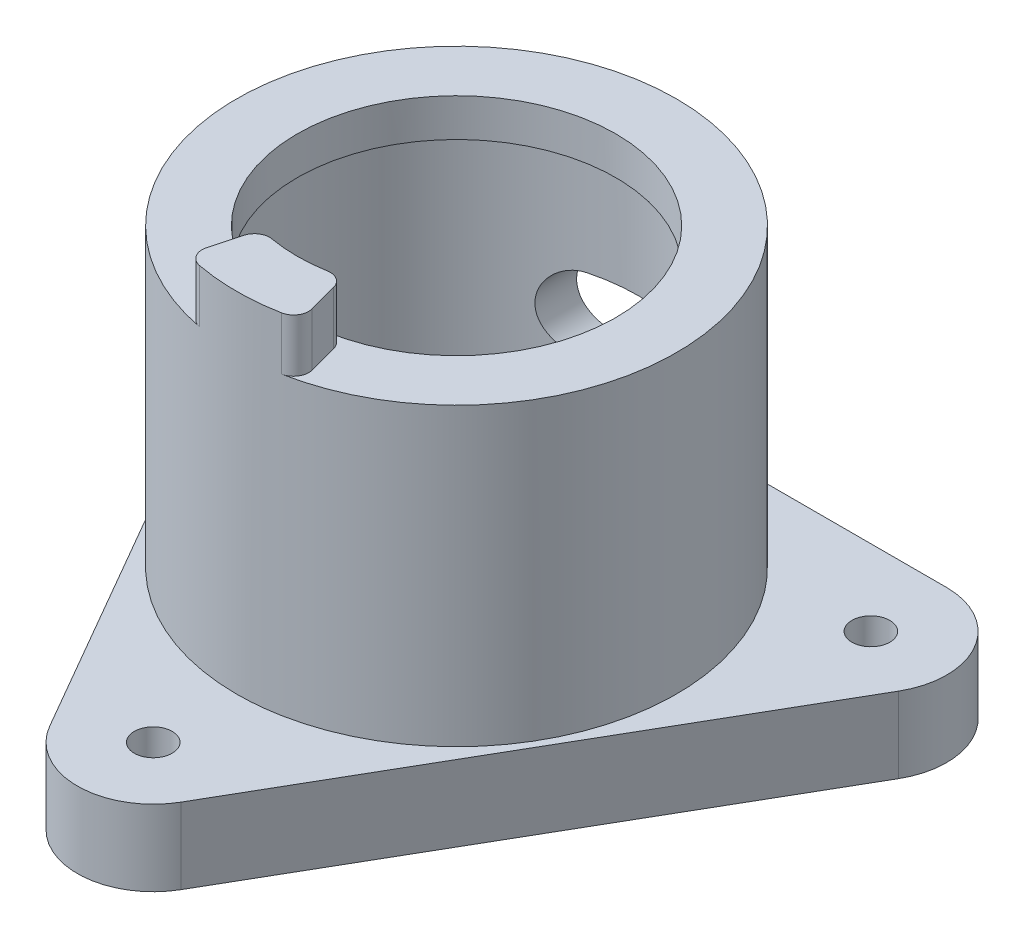
ISO-10303-21;
HEADER;
FILE_DESCRIPTION(('STEP AP214'),'2;1');
FILE_NAME('part.step','',(''),(''),'','','');
FILE_SCHEMA(('AUTOMOTIVE_DESIGN { 1 0 10303 214 1 1 1 1 }'));
ENDSEC;
DATA;
#1=APPLICATION_CONTEXT('core data for automotive mechanical design processes');
#2=APPLICATION_PROTOCOL_DEFINITION('international standard','automotive_design',2000,#1);
#3=PRODUCT_CONTEXT('',#1,'mechanical');
#4=PRODUCT('Part','Part','',(#3));
#5=PRODUCT_RELATED_PRODUCT_CATEGORY('part','',(#4));
#6=PRODUCT_DEFINITION_FORMATION('','',#4);
#7=PRODUCT_DEFINITION_CONTEXT('part definition',#1,'design');
#8=PRODUCT_DEFINITION('design','',#6,#7);
#9=PRODUCT_DEFINITION_SHAPE('','',#8);
#10=(LENGTH_UNIT() NAMED_UNIT(*) SI_UNIT(.MILLI.,.METRE.));
#11=(NAMED_UNIT(*) PLANE_ANGLE_UNIT() SI_UNIT($,.RADIAN.));
#12=(NAMED_UNIT(*) SI_UNIT($,.STERADIAN.) SOLID_ANGLE_UNIT());
#13=UNCERTAINTY_MEASURE_WITH_UNIT(LENGTH_MEASURE(1.E-05),#10,'distance_accuracy_value','');
#14=(GEOMETRIC_REPRESENTATION_CONTEXT(3) GLOBAL_UNCERTAINTY_ASSIGNED_CONTEXT((#13)) GLOBAL_UNIT_ASSIGNED_CONTEXT((#10,
#11,#12)) REPRESENTATION_CONTEXT('',''));
#15=CARTESIAN_POINT('',(0.,0.,0.));
#16=DIRECTION('',(0.,0.,1.));
#17=DIRECTION('',(1.,0.,0.));
#18=AXIS2_PLACEMENT_3D('',#15,#16,#17);
#19=CARTESIAN_POINT('',(17.3205080756888,5.,-9.99999999999998));
#20=DIRECTION('',(0.,1.,0.));
#21=DIRECTION('',(0.,0.,1.));
#22=AXIS2_PLACEMENT_3D('',#19,#20,#21);
#23=PLANE('',#22);
#24=CARTESIAN_POINT('',(17.3205080756888,5.,-9.99999999999998));
#25=DIRECTION('',(0.,1.,0.));
#26=DIRECTION('',(0.,0.,1.));
#27=AXIS2_PLACEMENT_3D('',#24,#25,#26);
#28=CIRCLE('',#27,5.);
#29=CARTESIAN_POINT('',(21.6506350946111,5.,-7.49999999999974));
#30=VERTEX_POINT('',#29);
#31=CARTESIAN_POINT('',(17.3205080756889,5.,-14.9999999999998));
#32=VERTEX_POINT('',#31);
#33=EDGE_CURVE('E289',#30,#32,#28,.T.);
#34=ORIENTED_EDGE('',*,*,#33,.T.);
#35=DIRECTION('',(-1.,0.,0.));
#36=VECTOR('',#35,1.);
#37=CARTESIAN_POINT('',(17.3205080756889,5.,-14.9999999999998));
#38=LINE('',#37,#36);
#39=CARTESIAN_POINT('',(-17.3205080756886,5.,-15.));
#40=VERTEX_POINT('',#39);
#41=EDGE_CURVE('E330',#32,#40,#38,.T.);
#42=ORIENTED_EDGE('',*,*,#41,.T.);
#43=CARTESIAN_POINT('',(-17.3205080756886,5.,-9.99999999999996));
#44=DIRECTION('',(0.,1.,0.));
#45=DIRECTION('',(0.,0.,1.));
#46=AXIS2_PLACEMENT_3D('',#43,#44,#45);
#47=CIRCLE('',#46,5.00000000000007);
#48=CARTESIAN_POINT('',(-21.6506350946109,5.,-7.50000000000001));
#49=VERTEX_POINT('',#48);
#50=EDGE_CURVE('E333',#40,#49,#47,.T.);
#51=ORIENTED_EDGE('',*,*,#50,.T.);
#52=DIRECTION('',(0.499999999999998,0.,0.86602540378444));
#53=VECTOR('',#52,1.);
#54=CARTESIAN_POINT('',(-21.6506350946109,5.,-7.50000000000001));
#55=LINE('',#54,#53);
#56=CARTESIAN_POINT('',(-4.33012701892213,5.,22.4999999999999));
#57=VERTEX_POINT('',#56);
#58=EDGE_CURVE('E335',#49,#57,#55,.T.);
#59=ORIENTED_EDGE('',*,*,#58,.T.);
#60=CARTESIAN_POINT('',(1.28191059012694E-13,5.,19.9999999999999));
#61=DIRECTION('',(0.,1.,0.));
#62=DIRECTION('',(0.,0.,1.));
#63=AXIS2_PLACEMENT_3D('',#60,#61,#62);
#64=CIRCLE('',#63,5.00000000000007);
#65=CARTESIAN_POINT('',(4.33012701892225,5.,22.5));
#66=VERTEX_POINT('',#65);
#67=EDGE_CURVE('E337',#57,#66,#64,.T.);
#68=ORIENTED_EDGE('',*,*,#67,.T.);
#69=DIRECTION('',(0.500000000000004,0.,-0.866025403784436));
#70=VECTOR('',#69,1.);
#71=CARTESIAN_POINT('',(21.6506350946111,5.,-7.49999999999974));
#72=LINE('',#71,#70);
#73=EDGE_CURVE('E339',#66,#30,#72,.T.);
#74=ORIENTED_EDGE('',*,*,#73,.T.);
#75=EDGE_LOOP('',(#34,#42,#51,#59,#68,#74));
#76=FACE_BOUND('',#75,.T.);
#77=CARTESIAN_POINT('',(0.,5.,20.));
#78=DIRECTION('',(0.,1.,0.));
#79=DIRECTION('',(0.,0.,1.));
#80=AXIS2_PLACEMENT_3D('',#77,#78,#79);
#81=CIRCLE('',#80,1.25);
#82=CARTESIAN_POINT('',(0.,5.,21.25));
#83=VERTEX_POINT('',#82);
#84=EDGE_CURVE('E294',#83,#83,#81,.T.);
#85=ORIENTED_EDGE('',*,*,#84,.F.);
#86=EDGE_LOOP('',(#85));
#87=FACE_BOUND('',#86,.T.);
#88=CARTESIAN_POINT('',(-17.3205080756888,5.,-9.99999999999999));
#89=DIRECTION('',(0.,1.,0.));
#90=DIRECTION('',(0.,0.,1.));
#91=AXIS2_PLACEMENT_3D('',#88,#89,#90);
#92=CIRCLE('',#91,1.25);
#93=CARTESIAN_POINT('',(-17.3205080756888,5.,-8.75));
#94=VERTEX_POINT('',#93);
#95=EDGE_CURVE('E298',#94,#94,#92,.T.);
#96=ORIENTED_EDGE('',*,*,#95,.F.);
#97=EDGE_LOOP('',(#96));
#98=FACE_BOUND('',#97,.T.);
#99=CARTESIAN_POINT('',(17.3205080756888,5.,-10.));
#100=DIRECTION('',(0.,1.,0.));
#101=DIRECTION('',(0.,0.,1.));
#102=AXIS2_PLACEMENT_3D('',#99,#100,#101);
#103=CIRCLE('',#102,1.25);
#104=CARTESIAN_POINT('',(17.3205080756888,5.,-8.75000000000001));
#105=VERTEX_POINT('',#104);
#106=EDGE_CURVE('E302',#105,#105,#103,.T.);
#107=ORIENTED_EDGE('',*,*,#106,.F.);
#108=EDGE_LOOP('',(#107));
#109=FACE_BOUND('',#108,.T.);
#110=CARTESIAN_POINT('',(0.,5.,0.));
#111=DIRECTION('',(0.,1.,0.));
#112=DIRECTION('',(0.,0.,1.));
#113=AXIS2_PLACEMENT_3D('',#110,#111,#112);
#114=CIRCLE('',#113,14.5);
#115=CARTESIAN_POINT('',(0.,5.,14.5));
#116=VERTEX_POINT('',#115);
#117=EDGE_CURVE('E305',#116,#116,#114,.T.);
#118=ORIENTED_EDGE('',*,*,#117,.F.);
#119=EDGE_LOOP('',(#118));
#120=FACE_BOUND('',#119,.T.);
#121=ADVANCED_FACE('F39',(#76,#87,#98,#109,#120),#23,.T.);
#122=CARTESIAN_POINT('',(17.3205080756888,0.,-9.99999999999998));
#123=DIRECTION('',(0.,1.,0.));
#124=DIRECTION('',(0.,0.,1.));
#125=AXIS2_PLACEMENT_3D('',#122,#123,#124);
#126=PLANE('',#125);
#127=CARTESIAN_POINT('',(17.3205080756888,0.,-10.));
#128=DIRECTION('',(0.,1.,0.));
#129=DIRECTION('',(0.,0.,1.));
#130=AXIS2_PLACEMENT_3D('',#127,#128,#129);
#131=CIRCLE('',#130,1.25);
#132=CARTESIAN_POINT('',(17.3205080756888,0.,-8.75000000000001));
#133=VERTEX_POINT('',#132);
#134=EDGE_CURVE('E308',#133,#133,#131,.T.);
#135=ORIENTED_EDGE('',*,*,#134,.T.);
#136=EDGE_LOOP('',(#135));
#137=FACE_BOUND('',#136,.T.);
#138=CARTESIAN_POINT('',(-17.3205080756888,0.,-9.99999999999999));
#139=DIRECTION('',(0.,1.,0.));
#140=DIRECTION('',(0.,0.,1.));
#141=AXIS2_PLACEMENT_3D('',#138,#139,#140);
#142=CIRCLE('',#141,1.25);
#143=CARTESIAN_POINT('',(-17.3205080756888,0.,-8.75));
#144=VERTEX_POINT('',#143);
#145=EDGE_CURVE('E317',#144,#144,#142,.T.);
#146=ORIENTED_EDGE('',*,*,#145,.T.);
#147=EDGE_LOOP('',(#146));
#148=FACE_BOUND('',#147,.T.);
#149=CARTESIAN_POINT('',(0.,0.,20.));
#150=DIRECTION('',(0.,1.,0.));
#151=DIRECTION('',(0.,0.,1.));
#152=AXIS2_PLACEMENT_3D('',#149,#150,#151);
#153=CIRCLE('',#152,1.25);
#154=CARTESIAN_POINT('',(0.,0.,21.25));
#155=VERTEX_POINT('',#154);
#156=EDGE_CURVE('E321',#155,#155,#153,.T.);
#157=ORIENTED_EDGE('',*,*,#156,.T.);
#158=EDGE_LOOP('',(#157));
#159=FACE_BOUND('',#158,.T.);
#160=CARTESIAN_POINT('',(17.3205080756888,0.,-9.99999999999998));
#161=DIRECTION('',(0.,1.,0.));
#162=DIRECTION('',(0.,0.,1.));
#163=AXIS2_PLACEMENT_3D('',#160,#161,#162);
#164=CIRCLE('',#163,5.);
#165=CARTESIAN_POINT('',(21.6506350946111,0.,-7.49999999999974));
#166=VERTEX_POINT('',#165);
#167=CARTESIAN_POINT('',(17.3205080756889,0.,-14.9999999999998));
#168=VERTEX_POINT('',#167);
#169=EDGE_CURVE('E328',#166,#168,#164,.T.);
#170=ORIENTED_EDGE('',*,*,#169,.F.);
#171=DIRECTION('',(0.500000000000004,0.,-0.866025403784436));
#172=VECTOR('',#171,1.);
#173=CARTESIAN_POINT('',(21.6506350946111,0.,-7.49999999999974));
#174=LINE('',#173,#172);
#175=CARTESIAN_POINT('',(4.33012701892225,0.,22.5));
#176=VERTEX_POINT('',#175);
#177=EDGE_CURVE('E331',#176,#166,#174,.T.);
#178=ORIENTED_EDGE('',*,*,#177,.F.);
#179=CARTESIAN_POINT('',(1.28191059012694E-13,0.,19.9999999999999));
#180=DIRECTION('',(0.,1.,0.));
#181=DIRECTION('',(0.,0.,1.));
#182=AXIS2_PLACEMENT_3D('',#179,#180,#181);
#183=CIRCLE('',#182,5.00000000000007);
#184=CARTESIAN_POINT('',(-4.33012701892213,0.,22.4999999999999));
#185=VERTEX_POINT('',#184);
#186=EDGE_CURVE('E350',#185,#176,#183,.T.);
#187=ORIENTED_EDGE('',*,*,#186,.F.);
#188=DIRECTION('',(0.499999999999998,0.,0.86602540378444));
#189=VECTOR('',#188,1.);
#190=CARTESIAN_POINT('',(-21.6506350946109,0.,-7.50000000000001));
#191=LINE('',#190,#189);
#192=CARTESIAN_POINT('',(-21.6506350946109,0.,-7.50000000000001));
#193=VERTEX_POINT('',#192);
#194=EDGE_CURVE('E348',#193,#185,#191,.T.);
#195=ORIENTED_EDGE('',*,*,#194,.F.);
#196=CARTESIAN_POINT('',(-17.3205080756886,0.,-9.99999999999996));
#197=DIRECTION('',(0.,1.,0.));
#198=DIRECTION('',(0.,0.,1.));
#199=AXIS2_PLACEMENT_3D('',#196,#197,#198);
#200=CIRCLE('',#199,5.00000000000007);
#201=CARTESIAN_POINT('',(-17.3205080756886,0.,-15.));
#202=VERTEX_POINT('',#201);
#203=EDGE_CURVE('E346',#202,#193,#200,.T.);
#204=ORIENTED_EDGE('',*,*,#203,.F.);
#205=DIRECTION('',(-1.,0.,0.));
#206=VECTOR('',#205,1.);
#207=CARTESIAN_POINT('',(17.3205080756889,0.,-14.9999999999998));
#208=LINE('',#207,#206);
#209=EDGE_CURVE('E344',#168,#202,#208,.T.);
#210=ORIENTED_EDGE('',*,*,#209,.F.);
#211=EDGE_LOOP('',(#170,#178,#187,#195,#204,#210));
#212=FACE_BOUND('',#211,.T.);
#213=CARTESIAN_POINT('',(0.,0.,0.));
#214=DIRECTION('',(0.,1.,0.));
#215=DIRECTION('',(0.,0.,1.));
#216=AXIS2_PLACEMENT_3D('',#213,#214,#215);
#217=CIRCLE('',#216,12.);
#218=CARTESIAN_POINT('',(0.,0.,12.));
#219=VERTEX_POINT('',#218);
#220=EDGE_CURVE('E324',#219,#219,#217,.T.);
#221=ORIENTED_EDGE('',*,*,#220,.T.);
#222=EDGE_LOOP('',(#221));
#223=FACE_BOUND('',#222,.T.);
#224=ADVANCED_FACE('F280',(#137,#148,#159,#212,#223),#126,.F.);
#225=CARTESIAN_POINT('',(17.3205080756888,5.,-9.99999999999998));
#226=DIRECTION('',(0.,-1.,0.));
#227=DIRECTION('',(0.,0.,-1.));
#228=AXIS2_PLACEMENT_3D('',#225,#226,#227);
#229=CYLINDRICAL_SURFACE('',#228,5.);
#230=ORIENTED_EDGE('',*,*,#169,.T.);
#231=DIRECTION('',(0.,-1.,0.));
#232=VECTOR('',#231,1.);
#233=CARTESIAN_POINT('',(17.3205080756889,5.,-14.9999999999998));
#234=LINE('',#233,#232);
#235=EDGE_CURVE('E171',#32,#168,#234,.T.);
#236=ORIENTED_EDGE('',*,*,#235,.F.);
#237=ORIENTED_EDGE('',*,*,#33,.F.);
#238=DIRECTION('',(0.,-1.,0.));
#239=VECTOR('',#238,1.);
#240=CARTESIAN_POINT('',(21.6506350946111,5.,-7.49999999999974));
#241=LINE('',#240,#239);
#242=EDGE_CURVE('E341',#30,#166,#241,.T.);
#243=ORIENTED_EDGE('',*,*,#242,.T.);
#244=EDGE_LOOP('',(#230,#236,#237,#243));
#245=FACE_BOUND('',#244,.T.);
#246=ADVANCED_FACE('F41',(#245),#229,.T.);
#247=CARTESIAN_POINT('',(17.3205080756889,5.,-14.9999999999998));
#248=DIRECTION('',(0.,0.,1.));
#249=DIRECTION('',(1.,0.,0.));
#250=AXIS2_PLACEMENT_3D('',#247,#248,#249);
#251=PLANE('',#250);
#252=ORIENTED_EDGE('',*,*,#209,.T.);
#253=DIRECTION('',(0.,-1.,0.));
#254=VECTOR('',#253,1.);
#255=CARTESIAN_POINT('',(-17.3205080756886,5.,-15.));
#256=LINE('',#255,#254);
#257=EDGE_CURVE('E364',#40,#202,#256,.T.);
#258=ORIENTED_EDGE('',*,*,#257,.F.);
#259=ORIENTED_EDGE('',*,*,#41,.F.);
#260=ORIENTED_EDGE('',*,*,#235,.T.);
#261=EDGE_LOOP('',(#252,#258,#259,#260));
#262=FACE_BOUND('',#261,.T.);
#263=ADVANCED_FACE('F512',(#262),#251,.F.);
#264=CARTESIAN_POINT('',(-17.3205080756886,5.,-9.99999999999996));
#265=DIRECTION('',(0.,-1.,0.));
#266=DIRECTION('',(0.,0.,-1.));
#267=AXIS2_PLACEMENT_3D('',#264,#265,#266);
#268=CYLINDRICAL_SURFACE('',#267,5.00000000000007);
#269=ORIENTED_EDGE('',*,*,#203,.T.);
#270=DIRECTION('',(0.,-1.,0.));
#271=VECTOR('',#270,1.);
#272=CARTESIAN_POINT('',(-21.6506350946109,5.,-7.50000000000001));
#273=LINE('',#272,#271);
#274=EDGE_CURVE('E361',#49,#193,#273,.T.);
#275=ORIENTED_EDGE('',*,*,#274,.F.);
#276=ORIENTED_EDGE('',*,*,#50,.F.);
#277=ORIENTED_EDGE('',*,*,#257,.T.);
#278=EDGE_LOOP('',(#269,#275,#276,#277));
#279=FACE_BOUND('',#278,.T.);
#280=ADVANCED_FACE('F509',(#279),#268,.T.);
#281=CARTESIAN_POINT('',(-21.6506350946109,5.,-7.50000000000001));
#282=DIRECTION('',(0.86602540378444,0.,-0.499999999999998));
#283=DIRECTION('',(-0.499999999999998,0.,-0.86602540378444));
#284=AXIS2_PLACEMENT_3D('',#281,#282,#283);
#285=PLANE('',#284);
#286=ORIENTED_EDGE('',*,*,#194,.T.);
#287=DIRECTION('',(0.,-1.,0.));
#288=VECTOR('',#287,1.);
#289=CARTESIAN_POINT('',(-4.33012701892213,5.,22.4999999999999));
#290=LINE('',#289,#288);
#291=EDGE_CURVE('E358',#57,#185,#290,.T.);
#292=ORIENTED_EDGE('',*,*,#291,.F.);
#293=ORIENTED_EDGE('',*,*,#58,.F.);
#294=ORIENTED_EDGE('',*,*,#274,.T.);
#295=EDGE_LOOP('',(#286,#292,#293,#294));
#296=FACE_BOUND('',#295,.T.);
#297=ADVANCED_FACE('F504',(#296),#285,.F.);
#298=CARTESIAN_POINT('',(1.28191059012694E-13,5.,19.9999999999999));
#299=DIRECTION('',(0.,-1.,0.));
#300=DIRECTION('',(0.,0.,-1.));
#301=AXIS2_PLACEMENT_3D('',#298,#299,#300);
#302=CYLINDRICAL_SURFACE('',#301,5.00000000000007);
#303=ORIENTED_EDGE('',*,*,#186,.T.);
#304=DIRECTION('',(0.,-1.,0.));
#305=VECTOR('',#304,1.);
#306=CARTESIAN_POINT('',(4.33012701892225,5.,22.5));
#307=LINE('',#306,#305);
#308=EDGE_CURVE('E355',#66,#176,#307,.T.);
#309=ORIENTED_EDGE('',*,*,#308,.F.);
#310=ORIENTED_EDGE('',*,*,#67,.F.);
#311=ORIENTED_EDGE('',*,*,#291,.T.);
#312=EDGE_LOOP('',(#303,#309,#310,#311));
#313=FACE_BOUND('',#312,.T.);
#314=ADVANCED_FACE('F500',(#313),#302,.T.);
#315=CARTESIAN_POINT('',(21.6506350946111,5.,-7.49999999999974));
#316=DIRECTION('',(-0.866025403784436,0.,-0.500000000000004));
#317=DIRECTION('',(-0.500000000000004,0.,0.866025403784436));
#318=AXIS2_PLACEMENT_3D('',#315,#316,#317);
#319=PLANE('',#318);
#320=ORIENTED_EDGE('',*,*,#177,.T.);
#321=ORIENTED_EDGE('',*,*,#242,.F.);
#322=ORIENTED_EDGE('',*,*,#73,.F.);
#323=ORIENTED_EDGE('',*,*,#308,.T.);
#324=EDGE_LOOP('',(#320,#321,#322,#323));
#325=FACE_BOUND('',#324,.T.);
#326=ADVANCED_FACE('F221',(#325),#319,.F.);
#327=CARTESIAN_POINT('',(0.,5.,0.));
#328=DIRECTION('',(0.,-1.,0.));
#329=DIRECTION('',(0.,0.,-1.));
#330=AXIS2_PLACEMENT_3D('',#327,#328,#329);
#331=CYLINDRICAL_SURFACE('',#330,12.);
#332=CARTESIAN_POINT('',(3.,9.5,-11.6189500386223));
#333=CARTESIAN_POINT('',(3.07360403993331,9.50000079930749,-11.5999498202118));
#334=CARTESIAN_POINT('',(3.14698259223645,9.50325186905357,-11.5802524261636));
#335=CARTESIAN_POINT('',(3.29281215672263,9.51612762974181,-11.5396317344697));
#336=CARTESIAN_POINT('',(3.36526345063524,9.52575033555729,-11.5187088204931));
#337=CARTESIAN_POINT('',(3.58021029585404,9.56392294464947,-11.4544466056659));
#338=CARTESIAN_POINT('',(3.7206832993467,9.60177872578611,-11.4095140945153));
#339=CARTESIAN_POINT('',(3.99213362881255,9.70074768448258,-11.317396275077));
#340=CARTESIAN_POINT('',(4.12311827108479,9.76184271047136,-11.2702127500896));
#341=CARTESIAN_POINT('',(4.37272206271164,9.90563134738984,-11.1757378208297));
#342=CARTESIAN_POINT('',(4.49133460073362,9.98833642427486,-11.1284463725388));
#343=CARTESIAN_POINT('',(4.71589611284603,10.1758215282738,-11.0351930454861));
#344=CARTESIAN_POINT('',(4.82145648981427,10.2810996858709,-10.9892935412877));
#345=CARTESIAN_POINT('',(5.01311892285581,10.5101573496807,-10.9031966426444));
#346=CARTESIAN_POINT('',(5.09922463864767,10.6339333688727,-10.8629981762779));
#347=CARTESIAN_POINT('',(5.2454754482452,10.8914713666513,-10.7931138833029));
#348=CARTESIAN_POINT('',(5.3065570245806,11.024597739154,-10.7630581878301));
#349=CARTESIAN_POINT('',(5.40484486161562,11.3012779019921,-10.7140428627232));
#350=CARTESIAN_POINT('',(5.44207498819915,11.4448211085299,-10.695072143082));
#351=CARTESIAN_POINT('',(5.48807086126969,11.7221766618782,-10.6715354706624));
#352=CARTESIAN_POINT('',(5.49938150159003,11.8554607429424,-10.6656830303571));
#353=CARTESIAN_POINT('',(5.50056828992668,12.1221318058033,-10.6650718690428));
#354=CARTESIAN_POINT('',(5.49045135766899,12.2555187404793,-10.6703095666332));
#355=CARTESIAN_POINT('',(5.45055929442183,12.5102968381362,-10.6907365509561));
#356=CARTESIAN_POINT('',(5.42198803168209,12.6319298250696,-10.7053159920034));
#357=CARTESIAN_POINT('',(5.34758914524172,12.8684479792591,-10.7426724322246));
#358=CARTESIAN_POINT('',(5.30175866032801,12.9833320240313,-10.7654507905774));
#359=CARTESIAN_POINT('',(5.19206493929214,13.2088313019123,-10.8187951276433));
#360=CARTESIAN_POINT('',(5.12748606808274,13.3190249752366,-10.849664172107));
#361=CARTESIAN_POINT('',(4.98329070701498,13.5272909446509,-10.9166444952707));
#362=CARTESIAN_POINT('',(4.90366900930938,13.6253590233321,-10.9527575884627));
#363=CARTESIAN_POINT('',(4.72278970810869,13.8168716698407,-11.0320411636807));
#364=CARTESIAN_POINT('',(4.62016783299758,13.9088862424478,-11.0755563322324));
#365=CARTESIAN_POINT('',(4.40163950331997,14.0746649923062,-11.1642051861911));
#366=CARTESIAN_POINT('',(4.28572309177784,14.1484153582054,-11.2093400670724));
#367=CARTESIAN_POINT('',(4.03462077666517,14.2805912130869,-11.3022560615091));
#368=CARTESIAN_POINT('',(3.8986513554195,14.3375594349679,-11.3499979078717));
#369=CARTESIAN_POINT('',(3.61804003288701,14.4268552664426,-11.4425304927735));
#370=CARTESIAN_POINT('',(3.47341308417947,14.4592241089408,-11.4873260541377));
#371=CARTESIAN_POINT('',(3.27258394542251,14.4856942160067,-11.5452755798985));
#372=CARTESIAN_POINT('',(3.2183020656736,14.4910506473935,-11.5605247426741));
#373=CARTESIAN_POINT('',(3.10938868491745,14.4981996768551,-11.5902923011545));
#374=CARTESIAN_POINT('',(3.05475779146001,14.4999973362756,-11.6048117060285));
#375=CARTESIAN_POINT('',(3.00000000000001,14.5,-11.6189500386223));
#376=B_SPLINE_CURVE_WITH_KNOTS('',3,(#332,#333,#334,#335,#336,#337,#338,#339,#340,#341,#342,
#343,#344,#345,#346,#347,#348,#349,#350,#351,#352,#353,#354,#355,#356,#357,#358,#359,#360,#361,
#362,#363,#364,#365,#366,#367,#368,#369,#370,#371,#372,#373,#374,#375),.UNSPECIFIED.,.F.,.F.,(4,
2,2,2,2,2,2,2,2,2,2,2,2,2,2,2,2,2,2,2,2,4),(0.,0.227894871360382,0.455718773906632,
0.910190550296794,1.36430807707472,1.81866704252706,2.28433302328946,2.74991133210695,
3.19598438045614,3.64161038579188,4.04116456223921,4.44058972809254,4.81627994271881,
5.19203246625351,5.58461199699046,5.97732768918208,6.40910325516609,6.84120433865265,
7.30394146020145,7.76590123140063,7.93572005436792,8.10529718411948),.UNSPECIFIED.);
#377=CARTESIAN_POINT('',(3.,9.5,-11.6189500386223));
#378=VERTEX_POINT('',#377);
#379=CARTESIAN_POINT('',(3.,14.5,-11.6189500386223));
#380=VERTEX_POINT('',#379);
#381=EDGE_CURVE('E178',#378,#380,#376,.T.);
#382=ORIENTED_EDGE('',*,*,#381,.F.);
#383=CARTESIAN_POINT('',(0.,9.5,0.));
#384=DIRECTION('',(0.,-1.,0.));
#385=DIRECTION('',(0.,0.,-1.));
#386=AXIS2_PLACEMENT_3D('',#383,#384,#385);
#387=CIRCLE('',#386,12.);
#388=CARTESIAN_POINT('',(-3.,9.5,-11.6189500386223));
#389=VERTEX_POINT('',#388);
#390=EDGE_CURVE('E212',#389,#378,#387,.T.);
#391=ORIENTED_EDGE('',*,*,#390,.F.);
#392=CARTESIAN_POINT('',(-3.,14.5,-11.6189500386223));
#393=CARTESIAN_POINT('',(-3.07360403993331,14.4999992006925,-11.5999498202118));
#394=CARTESIAN_POINT('',(-3.14698259223645,14.4967481309464,-11.5802524261636));
#395=CARTESIAN_POINT('',(-3.29281215672263,14.4838723702582,-11.5396317344697));
#396=CARTESIAN_POINT('',(-3.36526345063524,14.4742496644427,-11.5187088204931));
#397=CARTESIAN_POINT('',(-3.58021029585404,14.4360770553505,-11.4544466056659));
#398=CARTESIAN_POINT('',(-3.7206832993467,14.3982212742139,-11.4095140945153));
#399=CARTESIAN_POINT('',(-3.99213362881255,14.2992523155174,-11.317396275077));
#400=CARTESIAN_POINT('',(-4.12311827108479,14.2381572895286,-11.2702127500896));
#401=CARTESIAN_POINT('',(-4.37272206271164,14.0943686526102,-11.1757378208297));
#402=CARTESIAN_POINT('',(-4.49133460073362,14.0116635757251,-11.1284463725388));
#403=CARTESIAN_POINT('',(-4.71589611284602,13.8241784717262,-11.0351930454861));
#404=CARTESIAN_POINT('',(-4.82145648981427,13.7189003141291,-10.9892935412877));
#405=CARTESIAN_POINT('',(-5.01311892285581,13.4898426503193,-10.9031966426444));
#406=CARTESIAN_POINT('',(-5.09922463864767,13.3660666311273,-10.8629981762779));
#407=CARTESIAN_POINT('',(-5.2454754482452,13.1085286333487,-10.7931138833029));
#408=CARTESIAN_POINT('',(-5.3065570245806,12.975402260846,-10.7630581878301));
#409=CARTESIAN_POINT('',(-5.40484486161562,12.6987220980079,-10.7140428627232));
#410=CARTESIAN_POINT('',(-5.44207498819915,12.5551788914701,-10.695072143082));
#411=CARTESIAN_POINT('',(-5.48807086126969,12.2778233381218,-10.6715354706624));
#412=CARTESIAN_POINT('',(-5.49938150159003,12.1445392570576,-10.6656830303571));
#413=CARTESIAN_POINT('',(-5.50056828992668,11.8778681941967,-10.6650718690428));
#414=CARTESIAN_POINT('',(-5.490451357669,11.7444812595207,-10.6703095666332));
#415=CARTESIAN_POINT('',(-5.45055929442183,11.4897031618638,-10.6907365509561));
#416=CARTESIAN_POINT('',(-5.42198803168209,11.3680701749305,-10.7053159920034));
#417=CARTESIAN_POINT('',(-5.34758914524172,11.1315520207409,-10.7426724322246));
#418=CARTESIAN_POINT('',(-5.30175866032801,11.0166679759687,-10.7654507905774));
#419=CARTESIAN_POINT('',(-5.19206493929214,10.7911686980877,-10.8187951276433));
#420=CARTESIAN_POINT('',(-5.12748606808274,10.6809750247634,-10.849664172107));
#421=CARTESIAN_POINT('',(-4.98329070701498,10.4727090553491,-10.9166444952707));
#422=CARTESIAN_POINT('',(-4.90366900930938,10.3746409766679,-10.9527575884627));
#423=CARTESIAN_POINT('',(-4.72278970810869,10.1831283301593,-11.0320411636807));
#424=CARTESIAN_POINT('',(-4.62016783299758,10.0911137575522,-11.0755563322324));
#425=CARTESIAN_POINT('',(-4.40163950331997,9.92533500769381,-11.1642051861911));
#426=CARTESIAN_POINT('',(-4.28572309177784,9.85158464179456,-11.2093400670724));
#427=CARTESIAN_POINT('',(-4.03462077666517,9.71940878691312,-11.3022560615091));
#428=CARTESIAN_POINT('',(-3.8986513554195,9.66244056503209,-11.3499979078717));
#429=CARTESIAN_POINT('',(-3.61804003288701,9.57314473355745,-11.4425304927735));
#430=CARTESIAN_POINT('',(-3.47341308417947,9.5407758910592,-11.4873260541377));
#431=CARTESIAN_POINT('',(-3.27258394542251,9.51430578399334,-11.5452755798985));
#432=CARTESIAN_POINT('',(-3.2183020656736,9.50894935260651,-11.5605247426741));
#433=CARTESIAN_POINT('',(-3.10938868491745,9.50180032314492,-11.5902923011545));
#434=CARTESIAN_POINT('',(-3.05475779146001,9.50000266372436,-11.6048117060285));
#435=CARTESIAN_POINT('',(-3.00000000000001,9.49999999999996,-11.6189500386223));
#436=B_SPLINE_CURVE_WITH_KNOTS('',3,(#392,#393,#394,#395,#396,#397,#398,#399,#400,#401,#402,
#403,#404,#405,#406,#407,#408,#409,#410,#411,#412,#413,#414,#415,#416,#417,#418,#419,#420,#421,
#422,#423,#424,#425,#426,#427,#428,#429,#430,#431,#432,#433,#434,#435),.UNSPECIFIED.,.F.,.F.,(4,
2,2,2,2,2,2,2,2,2,2,2,2,2,2,2,2,2,2,2,2,4),(0.,0.227894871360381,0.455718773906632,
0.910190550296794,1.36430807707472,1.81866704252706,2.28433302328946,2.74991133210695,
3.19598438045614,3.64161038579188,4.04116456223921,4.44058972809255,4.81627994271881,
5.19203246625351,5.58461199699046,5.97732768918208,6.40910325516609,6.84120433865265,
7.30394146020145,7.76590123140063,7.93572005436792,8.10529718411948),.UNSPECIFIED.);
#437=CARTESIAN_POINT('',(-3.,14.5,-11.6189500386223));
#438=VERTEX_POINT('',#437);
#439=EDGE_CURVE('E205',#438,#389,#436,.T.);
#440=ORIENTED_EDGE('',*,*,#439,.F.);
#441=CARTESIAN_POINT('',(0.,14.5,0.));
#442=DIRECTION('',(0.,1.,0.));
#443=DIRECTION('',(-1.,0.,0.));
#444=AXIS2_PLACEMENT_3D('',#441,#442,#443);
#445=CIRCLE('',#444,12.);
#446=EDGE_CURVE('E213',#380,#438,#445,.T.);
#447=ORIENTED_EDGE('',*,*,#446,.F.);
#448=EDGE_LOOP('',(#382,#391,#440,#447));
#449=FACE_BOUND('',#448,.T.);
#450=ORIENTED_EDGE('',*,*,#220,.F.);
#451=EDGE_LOOP('',(#450));
#452=FACE_BOUND('',#451,.T.);
#453=CARTESIAN_POINT('',(0.,22.,0.));
#454=DIRECTION('',(0.,1.,0.));
#455=DIRECTION('',(0.,0.,1.));
#456=AXIS2_PLACEMENT_3D('',#453,#454,#455);
#457=CIRCLE('',#456,12.);
#458=CARTESIAN_POINT('',(0.,22.,12.));
#459=VERTEX_POINT('',#458);
#460=EDGE_CURVE('E306',#459,#459,#457,.T.);
#461=ORIENTED_EDGE('',*,*,#460,.T.);
#462=EDGE_LOOP('',(#461));
#463=FACE_BOUND('',#462,.T.);
#464=ADVANCED_FACE('F215',(#449,#452,#463),#331,.F.);
#465=CARTESIAN_POINT('',(0.,0.,20.));
#466=DIRECTION('',(0.,1.,0.));
#467=DIRECTION('',(0.,0.,1.));
#468=AXIS2_PLACEMENT_3D('',#465,#466,#467);
#469=CYLINDRICAL_SURFACE('',#468,1.25);
#470=ORIENTED_EDGE('',*,*,#156,.F.);
#471=EDGE_LOOP('',(#470));
#472=FACE_BOUND('',#471,.T.);
#473=ORIENTED_EDGE('',*,*,#84,.T.);
#474=EDGE_LOOP('',(#473));
#475=FACE_BOUND('',#474,.T.);
#476=ADVANCED_FACE('F220',(#472,#475),#469,.F.);
#477=CARTESIAN_POINT('',(-17.3205080756888,0.,-9.99999999999999));
#478=DIRECTION('',(0.,1.,0.));
#479=DIRECTION('',(0.,0.,1.));
#480=AXIS2_PLACEMENT_3D('',#477,#478,#479);
#481=CYLINDRICAL_SURFACE('',#480,1.25);
#482=ORIENTED_EDGE('',*,*,#145,.F.);
#483=EDGE_LOOP('',(#482));
#484=FACE_BOUND('',#483,.T.);
#485=ORIENTED_EDGE('',*,*,#95,.T.);
#486=EDGE_LOOP('',(#485));
#487=FACE_BOUND('',#486,.T.);
#488=ADVANCED_FACE('F472',(#484,#487),#481,.F.);
#489=CARTESIAN_POINT('',(17.3205080756888,0.,-10.));
#490=DIRECTION('',(0.,1.,0.));
#491=DIRECTION('',(0.,0.,1.));
#492=AXIS2_PLACEMENT_3D('',#489,#490,#491);
#493=CYLINDRICAL_SURFACE('',#492,1.25);
#494=ORIENTED_EDGE('',*,*,#134,.F.);
#495=EDGE_LOOP('',(#494));
#496=FACE_BOUND('',#495,.T.);
#497=ORIENTED_EDGE('',*,*,#106,.T.);
#498=EDGE_LOOP('',(#497));
#499=FACE_BOUND('',#498,.T.);
#500=ADVANCED_FACE('F468',(#496,#499),#493,.F.);
#501=CARTESIAN_POINT('',(0.,22.,0.));
#502=DIRECTION('',(0.,-1.,0.));
#503=DIRECTION('',(0.,0.,-1.));
#504=AXIS2_PLACEMENT_3D('',#501,#502,#503);
#505=CYLINDRICAL_SURFACE('',#504,14.5);
#506=CARTESIAN_POINT('',(0.,9.5,0.));
#507=DIRECTION('',(0.,-1.,0.));
#508=DIRECTION('',(0.,0.,-1.));
#509=AXIS2_PLACEMENT_3D('',#506,#507,#508);
#510=CIRCLE('',#509,14.5);
#511=CARTESIAN_POINT('',(-3.,9.5,-14.1862609591111));
#512=VERTEX_POINT('',#511);
#513=CARTESIAN_POINT('',(3.,9.5,-14.1862609591111));
#514=VERTEX_POINT('',#513);
#515=EDGE_CURVE('E52',#512,#514,#510,.T.);
#516=ORIENTED_EDGE('',*,*,#515,.T.);
#517=CARTESIAN_POINT('',(3.,9.5,-14.1862609591111));
#518=CARTESIAN_POINT('',(3.07255300733215,9.50000067808193,-14.1709213178012));
#519=CARTESIAN_POINT('',(3.14494727142017,9.50315988974901,-14.155026474463));
#520=CARTESIAN_POINT('',(3.28895518561032,9.51570282483575,-14.1222594486905));
#521=CARTESIAN_POINT('',(3.3605690050599,9.52508516942697,-14.1053874835079));
#522=CARTESIAN_POINT('',(3.57328230308738,9.56237567705552,-14.0535706570102));
#523=CARTESIAN_POINT('',(3.71257558305128,9.59942818094748,-14.017356475896));
#524=CARTESIAN_POINT('',(3.98221502153945,9.69656450771915,-13.9431549198382));
#525=CARTESIAN_POINT('',(4.1125643810011,9.75664003966675,-13.9051681875362));
#526=CARTESIAN_POINT('',(4.3611643279154,9.89817109482,-13.829213395508));
#527=CARTESIAN_POINT('',(4.47941175627485,9.97963218083541,-13.7912453432192));
#528=CARTESIAN_POINT('',(4.70234395014195,10.1633695630185,-13.7168510285192));
#529=CARTESIAN_POINT('',(4.80679226764464,10.2659466039123,-13.6804574416114));
#530=CARTESIAN_POINT('',(4.99680819820384,10.4886530358201,-13.6122049038284));
#531=CARTESIAN_POINT('',(5.08237743867979,10.6087809124271,-13.580345562175));
#532=CARTESIAN_POINT('',(5.22948181965261,10.8598385207325,-13.524369198187));
#533=CARTESIAN_POINT('',(5.29163227262329,10.9903629691827,-13.5000574456885));
#534=CARTESIAN_POINT('',(5.39274482809298,11.2613203510544,-13.4599886603588));
#535=CARTESIAN_POINT('',(5.43172051172273,11.401747427145,-13.4442266176098));
#536=CARTESIAN_POINT('',(5.48292028606153,11.678251568264,-13.4234234448533));
#537=CARTESIAN_POINT('',(5.49677958760404,11.813977620264,-13.4177276455115));
#538=CARTESIAN_POINT('',(5.50221858615802,12.0859360919733,-13.4154987570248));
#539=CARTESIAN_POINT('',(5.49380383867102,12.2221683769565,-13.4189633831242));
#540=CARTESIAN_POINT('',(5.45588209284762,12.4853901990795,-13.4344233778511));
#541=CARTESIAN_POINT('',(5.42725575294512,12.6125295283193,-13.4460624615141));
#542=CARTESIAN_POINT('',(5.35098236881651,12.8600330180664,-13.4765968242365));
#543=CARTESIAN_POINT('',(5.30333325588597,12.9803964400768,-13.4954928924761));
#544=CARTESIAN_POINT('',(5.18910920530113,13.214591703798,-13.5398294263759));
#545=CARTESIAN_POINT('',(5.12205863102748,13.328159945283,-13.5654326045897));
#546=CARTESIAN_POINT('',(4.97165627246994,13.5426410395962,-13.6212722242525));
#547=CARTESIAN_POINT('',(4.88830048699605,13.6435507761156,-13.6515098025575));
#548=CARTESIAN_POINT('',(4.70149648691503,13.8368846460447,-13.7170091786835));
#549=CARTESIAN_POINT('',(4.59708664774099,13.9283124656627,-13.7524707030452));
#550=CARTESIAN_POINT('',(4.37487697382523,14.0925620961874,-13.8247639075252));
#551=CARTESIAN_POINT('',(4.25706900384227,14.1653725146656,-13.861596410863));
#552=CARTESIAN_POINT('',(4.00507290609595,14.2936361275421,-13.9365518706904));
#553=CARTESIAN_POINT('',(3.87037116261132,14.3480941574028,-13.9746524343174));
#554=CARTESIAN_POINT('',(3.59310399807477,14.4329350874148,-14.04849048039));
#555=CARTESIAN_POINT('',(3.45055161766058,14.4633566965248,-14.0842316769934));
#556=CARTESIAN_POINT('',(3.25546847354823,14.4874404538411,-14.1299211669925));
#557=CARTESIAN_POINT('',(3.20452807797586,14.4921467046481,-14.1415610721209));
#558=CARTESIAN_POINT('',(3.10241893444209,14.4984227576519,-14.1643114531769));
#559=CARTESIAN_POINT('',(3.05125065435421,14.4999973414863,-14.1754227109165));
#560=CARTESIAN_POINT('',(3.,14.5,-14.1862609591111));
#561=B_SPLINE_CURVE_WITH_KNOTS('',3,(#517,#518,#519,#520,#521,#522,#523,#524,#525,#526,#527,
#528,#529,#530,#531,#532,#533,#534,#535,#536,#537,#538,#539,#540,#541,#542,#543,#544,#545,#546,
#547,#548,#549,#550,#551,#552,#553,#554,#555,#556,#557,#558,#559,#560),.UNSPECIFIED.,.F.,.F.,(4,
2,2,2,2,2,2,2,2,2,2,2,2,2,2,2,2,2,2,2,2,4),(0.,0.222323876585877,0.444598510429628,
0.888173164246795,1.33158823015954,1.77511875166918,2.22546776787579,2.67577794779048,
3.11325794885261,3.5504813197874,3.9580483620352,4.36551376016978,4.75624069815269,
5.14701013881499,5.5483154341636,5.94971933097433,6.37755511689033,6.80565208247497,
7.25419674935279,7.7020175859631,7.85933854241343,8.01641910578266),.UNSPECIFIED.);
#562=CARTESIAN_POINT('',(3.,14.5,-14.1862609591111));
#563=VERTEX_POINT('',#562);
#564=EDGE_CURVE('E11',#514,#563,#561,.T.);
#565=ORIENTED_EDGE('',*,*,#564,.T.);
#566=CARTESIAN_POINT('',(0.,14.5,0.));
#567=DIRECTION('',(0.,1.,0.));
#568=DIRECTION('',(-1.,0.,0.));
#569=AXIS2_PLACEMENT_3D('',#566,#567,#568);
#570=CIRCLE('',#569,14.5);
#571=CARTESIAN_POINT('',(-3.,14.5,-14.1862609591111));
#572=VERTEX_POINT('',#571);
#573=EDGE_CURVE('E166',#563,#572,#570,.T.);
#574=ORIENTED_EDGE('',*,*,#573,.T.);
#575=CARTESIAN_POINT('',(-3.,14.5,-14.1862609591111));
#576=CARTESIAN_POINT('',(-3.07255300733215,14.4999993219181,-14.1709213178012));
#577=CARTESIAN_POINT('',(-3.14494727142017,14.496840110251,-14.155026474463));
#578=CARTESIAN_POINT('',(-3.28895518561032,14.4842971751643,-14.1222594486905));
#579=CARTESIAN_POINT('',(-3.3605690050599,14.474914830573,-14.1053874835079));
#580=CARTESIAN_POINT('',(-3.57328230308738,14.4376243229445,-14.0535706570102));
#581=CARTESIAN_POINT('',(-3.71257558305128,14.4005718190525,-14.017356475896));
#582=CARTESIAN_POINT('',(-3.98221502153945,14.3034354922809,-13.9431549198382));
#583=CARTESIAN_POINT('',(-4.1125643810011,14.2433599603332,-13.9051681875362));
#584=CARTESIAN_POINT('',(-4.3611643279154,14.10182890518,-13.829213395508));
#585=CARTESIAN_POINT('',(-4.47941175627485,14.0203678191646,-13.7912453432192));
#586=CARTESIAN_POINT('',(-4.70234395014195,13.8366304369815,-13.7168510285192));
#587=CARTESIAN_POINT('',(-4.80679226764464,13.7340533960877,-13.6804574416114));
#588=CARTESIAN_POINT('',(-4.99680819820384,13.5113469641799,-13.6122049038284));
#589=CARTESIAN_POINT('',(-5.08237743867978,13.3912190875729,-13.580345562175));
#590=CARTESIAN_POINT('',(-5.22948181965261,13.1401614792675,-13.524369198187));
#591=CARTESIAN_POINT('',(-5.2916322726233,13.0096370308173,-13.5000574456885));
#592=CARTESIAN_POINT('',(-5.39274482809298,12.7386796489456,-13.4599886603588));
#593=CARTESIAN_POINT('',(-5.43172051172274,12.598252572855,-13.4442266176098));
#594=CARTESIAN_POINT('',(-5.48292028606153,12.321748431736,-13.4234234448533));
#595=CARTESIAN_POINT('',(-5.49677958760404,12.186022379736,-13.4177276455115));
#596=CARTESIAN_POINT('',(-5.50221858615803,11.9140639080267,-13.4154987570248));
#597=CARTESIAN_POINT('',(-5.49380383867102,11.7778316230435,-13.4189633831242));
#598=CARTESIAN_POINT('',(-5.45588209284762,11.5146098009205,-13.4344233778511));
#599=CARTESIAN_POINT('',(-5.42725575294512,11.3874704716807,-13.4460624615141));
#600=CARTESIAN_POINT('',(-5.35098236881651,11.1399669819336,-13.4765968242365));
#601=CARTESIAN_POINT('',(-5.30333325588597,11.0196035599232,-13.4954928924761));
#602=CARTESIAN_POINT('',(-5.18910920530113,10.785408296202,-13.5398294263759));
#603=CARTESIAN_POINT('',(-5.12205863102748,10.671840054717,-13.5654326045897));
#604=CARTESIAN_POINT('',(-4.97165627246994,10.4573589604038,-13.6212722242525));
#605=CARTESIAN_POINT('',(-4.88830048699605,10.3564492238844,-13.6515098025575));
#606=CARTESIAN_POINT('',(-4.70149648691504,10.1631153539553,-13.7170091786835));
#607=CARTESIAN_POINT('',(-4.59708664774099,10.0716875343373,-13.7524707030452));
#608=CARTESIAN_POINT('',(-4.37487697382523,9.90743790381258,-13.8247639075252));
#609=CARTESIAN_POINT('',(-4.25706900384227,9.83462748533437,-13.861596410863));
#610=CARTESIAN_POINT('',(-4.00507290609595,9.70636387245789,-13.9365518706904));
#611=CARTESIAN_POINT('',(-3.87037116261132,9.65190584259723,-13.9746524343174));
#612=CARTESIAN_POINT('',(-3.59310399807477,9.56706491258518,-14.04849048039));
#613=CARTESIAN_POINT('',(-3.45055161766058,9.53664330347517,-14.0842316769934));
#614=CARTESIAN_POINT('',(-3.25546847354823,9.51255954615888,-14.1299211669925));
#615=CARTESIAN_POINT('',(-3.20452807797586,9.50785329535194,-14.1415610721209));
#616=CARTESIAN_POINT('',(-3.10241893444209,9.50157724234811,-14.1643114531769));
#617=CARTESIAN_POINT('',(-3.05125065435421,9.50000265851366,-14.1754227109165));
#618=CARTESIAN_POINT('',(-3.,9.49999999999999,-14.1862609591111));
#619=B_SPLINE_CURVE_WITH_KNOTS('',3,(#575,#576,#577,#578,#579,#580,#581,#582,#583,#584,#585,
#586,#587,#588,#589,#590,#591,#592,#593,#594,#595,#596,#597,#598,#599,#600,#601,#602,#603,#604,
#605,#606,#607,#608,#609,#610,#611,#612,#613,#614,#615,#616,#617,#618),.UNSPECIFIED.,.F.,.F.,(4,
2,2,2,2,2,2,2,2,2,2,2,2,2,2,2,2,2,2,2,2,4),(0.,0.222323876585878,0.444598510429627,
0.888173164246796,1.33158823015954,1.77511875166917,2.22546776787579,2.67577794779048,
3.11325794885262,3.5504813197874,3.9580483620352,4.36551376016978,4.75624069815269,
5.14701013881499,5.5483154341636,5.94971933097433,6.37755511689034,6.80565208247497,
7.2541967493528,7.7020175859631,7.85933854241344,8.01641910578266),.UNSPECIFIED.);
#620=EDGE_CURVE('E170',#572,#512,#619,.T.);
#621=ORIENTED_EDGE('',*,*,#620,.T.);
#622=EDGE_LOOP('',(#516,#565,#574,#621));
#623=FACE_BOUND('',#622,.T.);
#624=ORIENTED_EDGE('',*,*,#117,.T.);
#625=EDGE_LOOP('',(#624));
#626=FACE_BOUND('',#625,.T.);
#627=CARTESIAN_POINT('',(0.,24.5,0.));
#628=DIRECTION('',(0.,1.,0.));
#629=DIRECTION('',(0.,0.,1.));
#630=AXIS2_PLACEMENT_3D('',#627,#628,#629);
#631=CIRCLE('',#630,14.5);
#632=CARTESIAN_POINT('',(2.70509014768632,24.5,14.245437420202));
#633=VERTEX_POINT('',#632);
#634=CARTESIAN_POINT('',(-2.70509014768632,24.5,14.245437420202));
#635=VERTEX_POINT('',#634);
#636=EDGE_CURVE('E311',#633,#635,#631,.T.);
#637=ORIENTED_EDGE('',*,*,#636,.F.);
#638=DIRECTION('',(0.,-1.,0.));
#639=VECTOR('',#638,1.);
#640=CARTESIAN_POINT('',(2.70509014768632,28.,14.245437420202));
#641=LINE('',#640,#639);
#642=CARTESIAN_POINT('',(2.70509014768632,28.,14.245437420202));
#643=VERTEX_POINT('',#642);
#644=EDGE_CURVE('E421',#643,#633,#641,.T.);
#645=ORIENTED_EDGE('',*,*,#644,.F.);
#646=CARTESIAN_POINT('',(0.,28.,0.));
#647=DIRECTION('',(0.,1.,0.));
#648=DIRECTION('',(0.,0.,1.));
#649=AXIS2_PLACEMENT_3D('',#646,#647,#648);
#650=CIRCLE('',#649,14.5);
#651=CARTESIAN_POINT('',(-2.70509014768632,28.,14.245437420202));
#652=VERTEX_POINT('',#651);
#653=EDGE_CURVE('E459',#652,#643,#650,.T.);
#654=ORIENTED_EDGE('',*,*,#653,.F.);
#655=DIRECTION('',(0.,-1.,0.));
#656=VECTOR('',#655,1.);
#657=CARTESIAN_POINT('',(-2.70509014768632,28.,14.245437420202));
#658=LINE('',#657,#656);
#659=EDGE_CURVE('E418',#652,#635,#658,.T.);
#660=ORIENTED_EDGE('',*,*,#659,.T.);
#661=EDGE_LOOP('',(#637,#645,#654,#660));
#662=FACE_BOUND('',#661,.T.);
#663=ADVANCED_FACE('F182',(#623,#626,#662),#505,.T.);
#664=CARTESIAN_POINT('',(0.,24.5,0.));
#665=DIRECTION('',(0.,1.,0.));
#666=DIRECTION('',(0.,0.,1.));
#667=AXIS2_PLACEMENT_3D('',#664,#665,#666);
#668=PLANE('',#667);
#669=CARTESIAN_POINT('',(1.99921883740717,24.5,11.3248895818086));
#670=DIRECTION('',(0.,1.,0.));
#671=DIRECTION('',(0.,0.,1.));
#672=AXIS2_PLACEMENT_3D('',#669,#670,#671);
#673=CIRCLE('',#672,1.);
#674=CARTESIAN_POINT('',(2.96514466369623,24.5,11.0660705367061));
#675=VERTEX_POINT('',#674);
#676=CARTESIAN_POINT('',(1.82537372111089,24.5,10.3401165746948));
#677=VERTEX_POINT('',#676);
#678=EDGE_CURVE('E230',#675,#677,#673,.T.);
#679=ORIENTED_EDGE('',*,*,#678,.F.);
#680=DIRECTION('',(-0.258819045102521,0.,-0.965925826289068));
#681=VECTOR('',#680,1.);
#682=CARTESIAN_POINT('',(2.96514466369623,24.5,11.0660705367061));
#683=LINE('',#682,#681);
#684=CARTESIAN_POINT('',(3.48445803275564,24.5,13.0041744150855));
#685=VERTEX_POINT('',#684);
#686=EDGE_CURVE('E410',#685,#675,#683,.T.);
#687=ORIENTED_EDGE('',*,*,#686,.F.);
#688=CARTESIAN_POINT('',(2.51853220646657,24.5,13.262993460188));
#689=DIRECTION('',(0.,1.,0.));
#690=DIRECTION('',(0.,0.,1.));
#691=AXIS2_PLACEMENT_3D('',#688,#689,#690);
#692=CIRCLE('',#691,1.);
#693=EDGE_CURVE('E398',#633,#685,#692,.T.);
#694=ORIENTED_EDGE('',*,*,#693,.F.);
#695=ORIENTED_EDGE('',*,*,#636,.T.);
#696=CARTESIAN_POINT('',(-2.51853220646657,24.5,13.262993460188));
#697=DIRECTION('',(0.,1.,0.));
#698=DIRECTION('',(0.,0.,-1.));
#699=AXIS2_PLACEMENT_3D('',#696,#697,#698);
#700=CIRCLE('',#699,1.);
#701=CARTESIAN_POINT('',(-3.48445803275564,24.5,13.0041744150855));
#702=VERTEX_POINT('',#701);
#703=EDGE_CURVE('E407',#702,#635,#700,.T.);
#704=ORIENTED_EDGE('',*,*,#703,.F.);
#705=DIRECTION('',(-0.258819045102521,0.,0.965925826289068));
#706=VECTOR('',#705,1.);
#707=CARTESIAN_POINT('',(-2.96514466369623,24.5,11.0660705367061));
#708=LINE('',#707,#706);
#709=CARTESIAN_POINT('',(-2.96514466369623,24.5,11.0660705367061));
#710=VERTEX_POINT('',#709);
#711=EDGE_CURVE('E381',#710,#702,#708,.T.);
#712=ORIENTED_EDGE('',*,*,#711,.F.);
#713=CARTESIAN_POINT('',(-1.99921883740717,24.5,11.3248895818086));
#714=DIRECTION('',(0.,1.,0.));
#715=DIRECTION('',(0.,0.,-1.));
#716=AXIS2_PLACEMENT_3D('',#713,#714,#715);
#717=CIRCLE('',#716,1.);
#718=CARTESIAN_POINT('',(-1.82537372111089,24.5,10.3401165746948));
#719=VERTEX_POINT('',#718);
#720=EDGE_CURVE('E378',#719,#710,#717,.T.);
#721=ORIENTED_EDGE('',*,*,#720,.F.);
#722=CARTESIAN_POINT('',(0.,24.5,0.));
#723=DIRECTION('',(0.,1.,0.));
#724=DIRECTION('',(0.,0.,1.));
#725=AXIS2_PLACEMENT_3D('',#722,#723,#724);
#726=CIRCLE('',#725,10.5);
#727=EDGE_CURVE('E370',#677,#719,#726,.T.);
#728=ORIENTED_EDGE('',*,*,#727,.F.);
#729=EDGE_LOOP('',(#679,#687,#694,#695,#704,#712,#721,#728));
#730=FACE_BOUND('',#729,.T.);
#731=ADVANCED_FACE('F270',(#730),#668,.T.);
#732=CARTESIAN_POINT('',(0.,22.,0.));
#733=DIRECTION('',(0.,1.,0.));
#734=DIRECTION('',(0.,0.,1.));
#735=AXIS2_PLACEMENT_3D('',#732,#733,#734);
#736=PLANE('',#735);
#737=ORIENTED_EDGE('',*,*,#460,.F.);
#738=EDGE_LOOP('',(#737));
#739=FACE_BOUND('',#738,.T.);
#740=CARTESIAN_POINT('',(0.,22.,0.));
#741=DIRECTION('',(0.,1.,0.));
#742=DIRECTION('',(0.,0.,1.));
#743=AXIS2_PLACEMENT_3D('',#740,#741,#742);
#744=CIRCLE('',#743,10.5);
#745=CARTESIAN_POINT('',(0.,22.,10.5));
#746=VERTEX_POINT('',#745);
#747=EDGE_CURVE('E375',#746,#746,#744,.T.);
#748=ORIENTED_EDGE('',*,*,#747,.T.);
#749=EDGE_LOOP('',(#748));
#750=FACE_BOUND('',#749,.T.);
#751=ADVANCED_FACE('F268',(#739,#750),#736,.F.);
#752=CARTESIAN_POINT('',(0.,24.5,0.));
#753=DIRECTION('',(0.,-1.,0.));
#754=DIRECTION('',(0.,0.,-1.));
#755=AXIS2_PLACEMENT_3D('',#752,#753,#754);
#756=CYLINDRICAL_SURFACE('',#755,10.5);
#757=ORIENTED_EDGE('',*,*,#727,.T.);
#758=DIRECTION('',(0.,-1.,0.));
#759=VECTOR('',#758,1.);
#760=CARTESIAN_POINT('',(-1.82537372111089,28.,10.3401165746948));
#761=LINE('',#760,#759);
#762=CARTESIAN_POINT('',(-1.82537372111089,28.,10.3401165746948));
#763=VERTEX_POINT('',#762);
#764=EDGE_CURVE('E384',#763,#719,#761,.T.);
#765=ORIENTED_EDGE('',*,*,#764,.F.);
#766=CARTESIAN_POINT('',(0.,28.,0.));
#767=DIRECTION('',(0.,-1.,0.));
#768=DIRECTION('',(0.,0.,1.));
#769=AXIS2_PLACEMENT_3D('',#766,#767,#768);
#770=CIRCLE('',#769,10.5);
#771=CARTESIAN_POINT('',(1.82537372111089,28.,10.3401165746948));
#772=VERTEX_POINT('',#771);
#773=EDGE_CURVE('E455',#772,#763,#770,.T.);
#774=ORIENTED_EDGE('',*,*,#773,.F.);
#775=DIRECTION('',(0.,-1.,0.));
#776=VECTOR('',#775,1.);
#777=CARTESIAN_POINT('',(1.82537372111089,28.,10.3401165746948));
#778=LINE('',#777,#776);
#779=EDGE_CURVE('E387',#772,#677,#778,.T.);
#780=ORIENTED_EDGE('',*,*,#779,.T.);
#781=EDGE_LOOP('',(#757,#765,#774,#780));
#782=FACE_BOUND('',#781,.T.);
#783=ORIENTED_EDGE('',*,*,#747,.F.);
#784=EDGE_LOOP('',(#783));
#785=FACE_BOUND('',#784,.T.);
#786=ADVANCED_FACE('F264',(#782,#785),#756,.F.);
#787=CARTESIAN_POINT('',(1.99921883740717,28.,11.3248895818086));
#788=DIRECTION('',(0.,-1.,0.));
#789=DIRECTION('',(0.,0.,-1.));
#790=AXIS2_PLACEMENT_3D('',#787,#788,#789);
#791=CYLINDRICAL_SURFACE('',#790,1.);
#792=ORIENTED_EDGE('',*,*,#678,.T.);
#793=ORIENTED_EDGE('',*,*,#779,.F.);
#794=CARTESIAN_POINT('',(1.99921883740717,28.,11.3248895818086));
#795=DIRECTION('',(0.,1.,0.));
#796=DIRECTION('',(0.,0.,1.));
#797=AXIS2_PLACEMENT_3D('',#794,#795,#796);
#798=CIRCLE('',#797,1.);
#799=CARTESIAN_POINT('',(2.96514466369623,28.,11.0660705367061));
#800=VERTEX_POINT('',#799);
#801=EDGE_CURVE('E231',#800,#772,#798,.T.);
#802=ORIENTED_EDGE('',*,*,#801,.F.);
#803=DIRECTION('',(0.,-1.,0.));
#804=VECTOR('',#803,1.);
#805=CARTESIAN_POINT('',(2.96514466369623,28.,11.0660705367061));
#806=LINE('',#805,#804);
#807=EDGE_CURVE('E435',#800,#675,#806,.T.);
#808=ORIENTED_EDGE('',*,*,#807,.T.);
#809=EDGE_LOOP('',(#792,#793,#802,#808));
#810=FACE_BOUND('',#809,.T.);
#811=ADVANCED_FACE('F260',(#810),#791,.T.);
#812=CARTESIAN_POINT('',(-1.99921883740717,28.,11.3248895818086));
#813=DIRECTION('',(0.,-1.,0.));
#814=DIRECTION('',(0.,0.,-1.));
#815=AXIS2_PLACEMENT_3D('',#812,#813,#814);
#816=CYLINDRICAL_SURFACE('',#815,1.);
#817=ORIENTED_EDGE('',*,*,#720,.T.);
#818=DIRECTION('',(0.,-1.,0.));
#819=VECTOR('',#818,1.);
#820=CARTESIAN_POINT('',(-2.96514466369623,28.,11.0660705367061));
#821=LINE('',#820,#819);
#822=CARTESIAN_POINT('',(-2.96514466369623,28.,11.0660705367061));
#823=VERTEX_POINT('',#822);
#824=EDGE_CURVE('E388',#823,#710,#821,.T.);
#825=ORIENTED_EDGE('',*,*,#824,.F.);
#826=CARTESIAN_POINT('',(-1.99921883740717,28.,11.3248895818086));
#827=DIRECTION('',(0.,1.,0.));
#828=DIRECTION('',(0.,0.,-1.));
#829=AXIS2_PLACEMENT_3D('',#826,#827,#828);
#830=CIRCLE('',#829,1.);
#831=EDGE_CURVE('E452',#763,#823,#830,.T.);
#832=ORIENTED_EDGE('',*,*,#831,.F.);
#833=ORIENTED_EDGE('',*,*,#764,.T.);
#834=EDGE_LOOP('',(#817,#825,#832,#833));
#835=FACE_BOUND('',#834,.T.);
#836=ADVANCED_FACE('F256',(#835),#816,.T.);
#837=CARTESIAN_POINT('',(-2.96514466369623,28.,11.0660705367061));
#838=DIRECTION('',(0.965925826289068,0.,0.258819045102521));
#839=DIRECTION('',(0.258819045102521,0.,-0.965925826289068));
#840=AXIS2_PLACEMENT_3D('',#837,#838,#839);
#841=PLANE('',#840);
#842=ORIENTED_EDGE('',*,*,#711,.T.);
#843=DIRECTION('',(0.,-1.,0.));
#844=VECTOR('',#843,1.);
#845=CARTESIAN_POINT('',(-3.48445803275564,28.,13.0041744150855));
#846=LINE('',#845,#844);
#847=CARTESIAN_POINT('',(-3.48445803275564,28.,13.0041744150855));
#848=VERTEX_POINT('',#847);
#849=EDGE_CURVE('E420',#848,#702,#846,.T.);
#850=ORIENTED_EDGE('',*,*,#849,.F.);
#851=DIRECTION('',(-0.258819045102521,0.,0.965925826289068));
#852=VECTOR('',#851,1.);
#853=CARTESIAN_POINT('',(-2.96514466369623,28.,11.0660705367061));
#854=LINE('',#853,#852);
#855=EDGE_CURVE('E450',#823,#848,#854,.T.);
#856=ORIENTED_EDGE('',*,*,#855,.F.);
#857=ORIENTED_EDGE('',*,*,#824,.T.);
#858=EDGE_LOOP('',(#842,#850,#856,#857));
#859=FACE_BOUND('',#858,.T.);
#860=ADVANCED_FACE('F252',(#859),#841,.F.);
#861=CARTESIAN_POINT('',(-2.51853220646657,28.,13.262993460188));
#862=DIRECTION('',(0.,-1.,0.));
#863=DIRECTION('',(0.,0.,-1.));
#864=AXIS2_PLACEMENT_3D('',#861,#862,#863);
#865=CYLINDRICAL_SURFACE('',#864,1.);
#866=ORIENTED_EDGE('',*,*,#703,.T.);
#867=ORIENTED_EDGE('',*,*,#659,.F.);
#868=CARTESIAN_POINT('',(-2.51853220646657,28.,13.262993460188));
#869=DIRECTION('',(0.,1.,0.));
#870=DIRECTION('',(0.,0.,-1.));
#871=AXIS2_PLACEMENT_3D('',#868,#869,#870);
#872=CIRCLE('',#871,1.);
#873=EDGE_CURVE('E461',#848,#652,#872,.T.);
#874=ORIENTED_EDGE('',*,*,#873,.F.);
#875=ORIENTED_EDGE('',*,*,#849,.T.);
#876=EDGE_LOOP('',(#866,#867,#874,#875));
#877=FACE_BOUND('',#876,.T.);
#878=ADVANCED_FACE('F248',(#877),#865,.T.);
#879=CARTESIAN_POINT('',(2.51853220646657,28.,13.262993460188));
#880=DIRECTION('',(0.,-1.,0.));
#881=DIRECTION('',(0.,0.,-1.));
#882=AXIS2_PLACEMENT_3D('',#879,#880,#881);
#883=CYLINDRICAL_SURFACE('',#882,1.);
#884=ORIENTED_EDGE('',*,*,#693,.T.);
#885=DIRECTION('',(0.,-1.,0.));
#886=VECTOR('',#885,1.);
#887=CARTESIAN_POINT('',(3.48445803275564,28.,13.0041744150855));
#888=LINE('',#887,#886);
#889=CARTESIAN_POINT('',(3.48445803275564,28.,13.0041744150855));
#890=VERTEX_POINT('',#889);
#891=EDGE_CURVE('E430',#890,#685,#888,.T.);
#892=ORIENTED_EDGE('',*,*,#891,.F.);
#893=CARTESIAN_POINT('',(2.51853220646657,28.,13.262993460188));
#894=DIRECTION('',(0.,1.,0.));
#895=DIRECTION('',(0.,0.,1.));
#896=AXIS2_PLACEMENT_3D('',#893,#894,#895);
#897=CIRCLE('',#896,1.);
#898=EDGE_CURVE('E460',#643,#890,#897,.T.);
#899=ORIENTED_EDGE('',*,*,#898,.F.);
#900=ORIENTED_EDGE('',*,*,#644,.T.);
#901=EDGE_LOOP('',(#884,#892,#899,#900));
#902=FACE_BOUND('',#901,.T.);
#903=ADVANCED_FACE('F244',(#902),#883,.T.);
#904=CARTESIAN_POINT('',(2.96514466369623,28.,11.0660705367061));
#905=DIRECTION('',(-0.965925826289068,0.,0.258819045102521));
#906=DIRECTION('',(0.258819045102521,0.,0.965925826289068));
#907=AXIS2_PLACEMENT_3D('',#904,#905,#906);
#908=PLANE('',#907);
#909=ORIENTED_EDGE('',*,*,#686,.T.);
#910=ORIENTED_EDGE('',*,*,#807,.F.);
#911=DIRECTION('',(-0.258819045102521,0.,-0.965925826289068));
#912=VECTOR('',#911,1.);
#913=CARTESIAN_POINT('',(2.96514466369623,28.,11.0660705367061));
#914=LINE('',#913,#912);
#915=EDGE_CURVE('E403',#890,#800,#914,.T.);
#916=ORIENTED_EDGE('',*,*,#915,.F.);
#917=ORIENTED_EDGE('',*,*,#891,.T.);
#918=EDGE_LOOP('',(#909,#910,#916,#917));
#919=FACE_BOUND('',#918,.T.);
#920=ADVANCED_FACE('F240',(#919),#908,.F.);
#921=CARTESIAN_POINT('',(1.99921883740717,28.,11.3248895818086));
#922=DIRECTION('',(0.,1.,0.));
#923=DIRECTION('',(0.,0.,1.));
#924=AXIS2_PLACEMENT_3D('',#921,#922,#923);
#925=PLANE('',#924);
#926=ORIENTED_EDGE('',*,*,#801,.T.);
#927=ORIENTED_EDGE('',*,*,#773,.T.);
#928=ORIENTED_EDGE('',*,*,#831,.T.);
#929=ORIENTED_EDGE('',*,*,#855,.T.);
#930=ORIENTED_EDGE('',*,*,#873,.T.);
#931=ORIENTED_EDGE('',*,*,#653,.T.);
#932=ORIENTED_EDGE('',*,*,#898,.T.);
#933=ORIENTED_EDGE('',*,*,#915,.T.);
#934=EDGE_LOOP('',(#926,#927,#928,#929,#930,#931,#932,#933));
#935=FACE_BOUND('',#934,.T.);
#936=ADVANCED_FACE('F236',(#935),#925,.T.);
#937=CARTESIAN_POINT('',(3.,12.,-15.));
#938=DIRECTION('',(0.,0.,1.));
#939=DIRECTION('',(1.,0.,0.));
#940=AXIS2_PLACEMENT_3D('',#937,#938,#939);
#941=CYLINDRICAL_SURFACE('',#940,2.5);
#942=ORIENTED_EDGE('',*,*,#381,.T.);
#943=DIRECTION('',(0.,0.,1.));
#944=VECTOR('',#943,1.);
#945=CARTESIAN_POINT('',(3.,14.5,-15.));
#946=LINE('',#945,#944);
#947=EDGE_CURVE('E59',#563,#380,#946,.T.);
#948=ORIENTED_EDGE('',*,*,#947,.F.);
#949=ORIENTED_EDGE('',*,*,#564,.F.);
#950=DIRECTION('',(0.,0.,1.));
#951=VECTOR('',#950,1.);
#952=CARTESIAN_POINT('',(3.,9.5,-15.));
#953=LINE('',#952,#951);
#954=EDGE_CURVE('E647',#514,#378,#953,.T.);
#955=ORIENTED_EDGE('',*,*,#954,.T.);
#956=EDGE_LOOP('',(#942,#948,#949,#955));
#957=FACE_BOUND('',#956,.T.);
#958=ADVANCED_FACE('F174',(#957),#941,.F.);
#959=CARTESIAN_POINT('',(3.,9.5,-15.));
#960=DIRECTION('',(0.,-1.,0.));
#961=DIRECTION('',(0.,0.,-1.));
#962=AXIS2_PLACEMENT_3D('',#959,#960,#961);
#963=PLANE('',#962);
#964=ORIENTED_EDGE('',*,*,#390,.T.);
#965=ORIENTED_EDGE('',*,*,#954,.F.);
#966=ORIENTED_EDGE('',*,*,#515,.F.);
#967=DIRECTION('',(0.,0.,1.));
#968=VECTOR('',#967,1.);
#969=CARTESIAN_POINT('',(-3.,9.5,-15.));
#970=LINE('',#969,#968);
#971=EDGE_CURVE('E648',#512,#389,#970,.T.);
#972=ORIENTED_EDGE('',*,*,#971,.T.);
#973=EDGE_LOOP('',(#964,#965,#966,#972));
#974=FACE_BOUND('',#973,.T.);
#975=ADVANCED_FACE('F201',(#974),#963,.F.);
#976=CARTESIAN_POINT('',(-3.,12.,-15.));
#977=DIRECTION('',(0.,0.,1.));
#978=DIRECTION('',(1.,0.,0.));
#979=AXIS2_PLACEMENT_3D('',#976,#977,#978);
#980=CYLINDRICAL_SURFACE('',#979,2.5);
#981=ORIENTED_EDGE('',*,*,#439,.T.);
#982=ORIENTED_EDGE('',*,*,#971,.F.);
#983=ORIENTED_EDGE('',*,*,#620,.F.);
#984=DIRECTION('',(0.,0.,1.));
#985=VECTOR('',#984,1.);
#986=CARTESIAN_POINT('',(-3.,14.5,-15.));
#987=LINE('',#986,#985);
#988=EDGE_CURVE('E64',#572,#438,#987,.T.);
#989=ORIENTED_EDGE('',*,*,#988,.T.);
#990=EDGE_LOOP('',(#981,#982,#983,#989));
#991=FACE_BOUND('',#990,.T.);
#992=ADVANCED_FACE('F196',(#991),#980,.F.);
#993=CARTESIAN_POINT('',(-3.,14.5,-15.));
#994=DIRECTION('',(0.,1.,0.));
#995=DIRECTION('',(-1.,0.,0.));
#996=AXIS2_PLACEMENT_3D('',#993,#994,#995);
#997=PLANE('',#996);
#998=ORIENTED_EDGE('',*,*,#446,.T.);
#999=ORIENTED_EDGE('',*,*,#988,.F.);
#1000=ORIENTED_EDGE('',*,*,#573,.F.);
#1001=ORIENTED_EDGE('',*,*,#947,.T.);
#1002=EDGE_LOOP('',(#998,#999,#1000,#1001));
#1003=FACE_BOUND('',#1002,.T.);
#1004=ADVANCED_FACE('F167',(#1003),#997,.F.);
#1005=CLOSED_SHELL('',(#121,#224,#246,#263,#280,#297,#314,#326,#464,#476,#488,#500,#663,#731,
#751,#786,#811,#836,#860,#878,#903,#920,#936,#958,#975,#992,#1004));
#1006=MANIFOLD_SOLID_BREP('B2',#1005);
#1007=ADVANCED_BREP_SHAPE_REPRESENTATION('',(#18,#1006),#14);
#1008=SHAPE_DEFINITION_REPRESENTATION(#9,#1007);
ENDSEC;
END-ISO-10303-21;
